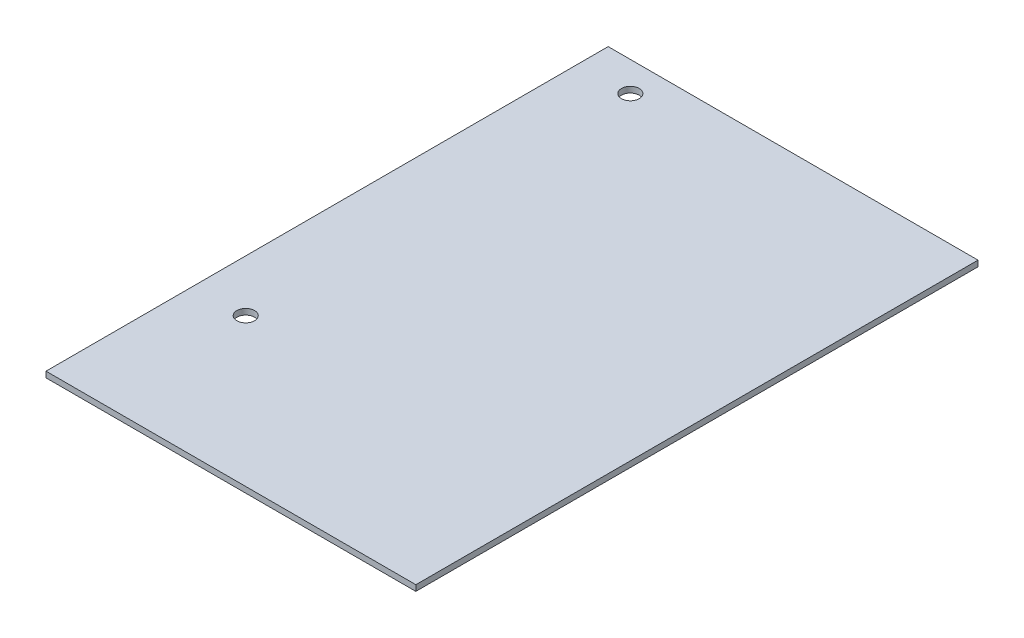
ISO-10303-21;
HEADER;
FILE_DESCRIPTION(('STEP AP214'),'2;1');
FILE_NAME('part.step','',(''),(''),'','','');
FILE_SCHEMA(('AUTOMOTIVE_DESIGN { 1 0 10303 214 1 1 1 1 }'));
ENDSEC;
DATA;
#1=APPLICATION_CONTEXT('core data for automotive mechanical design processes');
#2=APPLICATION_PROTOCOL_DEFINITION('international standard','automotive_design',2000,#1);
#3=PRODUCT_CONTEXT('',#1,'mechanical');
#4=PRODUCT('Part','Part','',(#3));
#5=PRODUCT_RELATED_PRODUCT_CATEGORY('part','',(#4));
#6=PRODUCT_DEFINITION_FORMATION('','',#4);
#7=PRODUCT_DEFINITION_CONTEXT('part definition',#1,'design');
#8=PRODUCT_DEFINITION('design','',#6,#7);
#9=PRODUCT_DEFINITION_SHAPE('','',#8);
#10=(LENGTH_UNIT() NAMED_UNIT(*) SI_UNIT(.MILLI.,.METRE.));
#11=(NAMED_UNIT(*) PLANE_ANGLE_UNIT() SI_UNIT($,.RADIAN.));
#12=(NAMED_UNIT(*) SI_UNIT($,.STERADIAN.) SOLID_ANGLE_UNIT());
#13=UNCERTAINTY_MEASURE_WITH_UNIT(LENGTH_MEASURE(1.E-05),#10,'distance_accuracy_value','');
#14=(GEOMETRIC_REPRESENTATION_CONTEXT(3) GLOBAL_UNCERTAINTY_ASSIGNED_CONTEXT((#13)) GLOBAL_UNIT_ASSIGNED_CONTEXT((#10,
#11,#12)) REPRESENTATION_CONTEXT('',''));
#15=CARTESIAN_POINT('',(0.,0.,0.));
#16=DIRECTION('',(0.,0.,1.));
#17=DIRECTION('',(1.,0.,0.));
#18=AXIS2_PLACEMENT_3D('',#15,#16,#17);
#19=CARTESIAN_POINT('',(0.,1.,0.));
#20=DIRECTION('',(1.,0.,0.));
#21=DIRECTION('',(0.,0.,-1.));
#22=AXIS2_PLACEMENT_3D('',#19,#20,#21);
#23=PLANE('',#22);
#24=DIRECTION('',(0.,0.,1.));
#25=VECTOR('',#24,1.);
#26=CARTESIAN_POINT('',(0.,0.,0.));
#27=LINE('',#26,#25);
#28=CARTESIAN_POINT('',(0.,0.,-96.52));
#29=VERTEX_POINT('',#28);
#30=CARTESIAN_POINT('',(0.,0.,0.));
#31=VERTEX_POINT('',#30);
#32=EDGE_CURVE('E98',#29,#31,#27,.T.);
#33=ORIENTED_EDGE('',*,*,#32,.T.);
#34=DIRECTION('',(0.,-1.,0.));
#35=VECTOR('',#34,1.);
#36=CARTESIAN_POINT('',(0.,1.,0.));
#37=LINE('',#36,#35);
#38=CARTESIAN_POINT('',(0.,1.,0.));
#39=VERTEX_POINT('',#38);
#40=EDGE_CURVE('E11',#39,#31,#37,.T.);
#41=ORIENTED_EDGE('',*,*,#40,.F.);
#42=DIRECTION('',(0.,0.,1.));
#43=VECTOR('',#42,1.);
#44=CARTESIAN_POINT('',(0.,1.,0.));
#45=LINE('',#44,#43);
#46=CARTESIAN_POINT('',(0.,1.,-96.52));
#47=VERTEX_POINT('',#46);
#48=EDGE_CURVE('E85',#47,#39,#45,.T.);
#49=ORIENTED_EDGE('',*,*,#48,.F.);
#50=DIRECTION('',(0.,-1.,0.));
#51=VECTOR('',#50,1.);
#52=CARTESIAN_POINT('',(0.,1.,-96.52));
#53=LINE('',#52,#51);
#54=EDGE_CURVE('E94',#47,#29,#53,.T.);
#55=ORIENTED_EDGE('',*,*,#54,.T.);
#56=EDGE_LOOP('',(#33,#41,#49,#55));
#57=FACE_BOUND('',#56,.T.);
#58=ADVANCED_FACE('F32',(#57),#23,.F.);
#59=CARTESIAN_POINT('',(0.,1.,0.));
#60=DIRECTION('',(0.,0.,-1.));
#61=DIRECTION('',(-1.,0.,0.));
#62=AXIS2_PLACEMENT_3D('',#59,#60,#61);
#63=PLANE('',#62);
#64=DIRECTION('',(1.,0.,0.));
#65=VECTOR('',#64,1.);
#66=CARTESIAN_POINT('',(0.,0.,0.));
#67=LINE('',#66,#65);
#68=CARTESIAN_POINT('',(63.5,0.,0.));
#69=VERTEX_POINT('',#68);
#70=EDGE_CURVE('E89',#31,#69,#67,.T.);
#71=ORIENTED_EDGE('',*,*,#70,.T.);
#72=DIRECTION('',(0.,-1.,0.));
#73=VECTOR('',#72,1.);
#74=CARTESIAN_POINT('',(63.5,1.,0.));
#75=LINE('',#74,#73);
#76=CARTESIAN_POINT('',(63.5,1.,0.));
#77=VERTEX_POINT('',#76);
#78=EDGE_CURVE('E41',#77,#69,#75,.T.);
#79=ORIENTED_EDGE('',*,*,#78,.F.);
#80=DIRECTION('',(1.,0.,0.));
#81=VECTOR('',#80,1.);
#82=CARTESIAN_POINT('',(0.,1.,0.));
#83=LINE('',#82,#81);
#84=EDGE_CURVE('E80',#39,#77,#83,.T.);
#85=ORIENTED_EDGE('',*,*,#84,.F.);
#86=ORIENTED_EDGE('',*,*,#40,.T.);
#87=EDGE_LOOP('',(#71,#79,#85,#86));
#88=FACE_BOUND('',#87,.T.);
#89=ADVANCED_FACE('F88',(#88),#63,.F.);
#90=CARTESIAN_POINT('',(63.5,1.,0.));
#91=DIRECTION('',(-1.,0.,0.));
#92=DIRECTION('',(0.,0.,1.));
#93=AXIS2_PLACEMENT_3D('',#90,#91,#92);
#94=PLANE('',#93);
#95=DIRECTION('',(0.,0.,-1.));
#96=VECTOR('',#95,1.);
#97=CARTESIAN_POINT('',(63.5,0.,0.));
#98=LINE('',#97,#96);
#99=CARTESIAN_POINT('',(63.5,0.,-96.52));
#100=VERTEX_POINT('',#99);
#101=EDGE_CURVE('E67',#69,#100,#98,.T.);
#102=ORIENTED_EDGE('',*,*,#101,.T.);
#103=DIRECTION('',(0.,-1.,0.));
#104=VECTOR('',#103,1.);
#105=CARTESIAN_POINT('',(63.5,1.,-96.52));
#106=LINE('',#105,#104);
#107=CARTESIAN_POINT('',(63.5,1.,-96.52));
#108=VERTEX_POINT('',#107);
#109=EDGE_CURVE('E90',#108,#100,#106,.T.);
#110=ORIENTED_EDGE('',*,*,#109,.F.);
#111=DIRECTION('',(0.,0.,-1.));
#112=VECTOR('',#111,1.);
#113=CARTESIAN_POINT('',(63.5,1.,0.));
#114=LINE('',#113,#112);
#115=EDGE_CURVE('E83',#77,#108,#114,.T.);
#116=ORIENTED_EDGE('',*,*,#115,.F.);
#117=ORIENTED_EDGE('',*,*,#78,.T.);
#118=EDGE_LOOP('',(#102,#110,#116,#117));
#119=FACE_BOUND('',#118,.T.);
#120=ADVANCED_FACE('F92',(#119),#94,.F.);
#121=CARTESIAN_POINT('',(0.,1.,-96.52));
#122=DIRECTION('',(0.,0.,1.));
#123=DIRECTION('',(1.,0.,0.));
#124=AXIS2_PLACEMENT_3D('',#121,#122,#123);
#125=PLANE('',#124);
#126=DIRECTION('',(-1.,0.,0.));
#127=VECTOR('',#126,1.);
#128=CARTESIAN_POINT('',(0.,0.,-96.52));
#129=LINE('',#128,#127);
#130=EDGE_CURVE('E73',#100,#29,#129,.T.);
#131=ORIENTED_EDGE('',*,*,#130,.T.);
#132=ORIENTED_EDGE('',*,*,#54,.F.);
#133=DIRECTION('',(-1.,0.,0.));
#134=VECTOR('',#133,1.);
#135=CARTESIAN_POINT('',(0.,1.,-96.52));
#136=LINE('',#135,#134);
#137=EDGE_CURVE('E50',#108,#47,#136,.T.);
#138=ORIENTED_EDGE('',*,*,#137,.F.);
#139=ORIENTED_EDGE('',*,*,#109,.T.);
#140=EDGE_LOOP('',(#131,#132,#138,#139));
#141=FACE_BOUND('',#140,.T.);
#142=ADVANCED_FACE('F125',(#141),#125,.F.);
#143=CARTESIAN_POINT('',(0.,1.,0.));
#144=DIRECTION('',(0.,-1.,0.));
#145=DIRECTION('',(0.,0.,-1.));
#146=AXIS2_PLACEMENT_3D('',#143,#144,#145);
#147=PLANE('',#146);
#148=CARTESIAN_POINT('',(8.89,1.,-25.4));
#149=DIRECTION('',(0.,1.,0.));
#150=DIRECTION('',(0.,0.,1.));
#151=AXIS2_PLACEMENT_3D('',#148,#149,#150);
#152=CIRCLE('',#151,1.524);
#153=CARTESIAN_POINT('',(8.89,1.,-23.876));
#154=VERTEX_POINT('',#153);
#155=EDGE_CURVE('E115',#154,#154,#152,.T.);
#156=ORIENTED_EDGE('',*,*,#155,.F.);
#157=EDGE_LOOP('',(#156));
#158=FACE_BOUND('',#157,.T.);
#159=CARTESIAN_POINT('',(8.89,1.,-91.44));
#160=DIRECTION('',(0.,1.,0.));
#161=DIRECTION('',(0.,0.,1.));
#162=AXIS2_PLACEMENT_3D('',#159,#160,#161);
#163=CIRCLE('',#162,1.524);
#164=CARTESIAN_POINT('',(8.89,1.,-89.916));
#165=VERTEX_POINT('',#164);
#166=EDGE_CURVE('E107',#165,#165,#163,.T.);
#167=ORIENTED_EDGE('',*,*,#166,.F.);
#168=EDGE_LOOP('',(#167));
#169=FACE_BOUND('',#168,.T.);
#170=ORIENTED_EDGE('',*,*,#48,.T.);
#171=ORIENTED_EDGE('',*,*,#84,.T.);
#172=ORIENTED_EDGE('',*,*,#115,.T.);
#173=ORIENTED_EDGE('',*,*,#137,.T.);
#174=EDGE_LOOP('',(#170,#171,#172,#173));
#175=FACE_BOUND('',#174,.T.);
#176=ADVANCED_FACE('F81',(#158,#169,#175),#147,.F.);
#177=CARTESIAN_POINT('',(0.,0.,0.));
#178=DIRECTION('',(0.,-1.,0.));
#179=DIRECTION('',(0.,0.,-1.));
#180=AXIS2_PLACEMENT_3D('',#177,#178,#179);
#181=PLANE('',#180);
#182=CARTESIAN_POINT('',(8.89,0.,-25.4));
#183=DIRECTION('',(0.,-1.,0.));
#184=DIRECTION('',(0.,0.,-1.));
#185=AXIS2_PLACEMENT_3D('',#182,#183,#184);
#186=CIRCLE('',#185,1.524);
#187=CARTESIAN_POINT('',(8.89,0.,-26.924));
#188=VERTEX_POINT('',#187);
#189=EDGE_CURVE('E35',#188,#188,#186,.T.);
#190=ORIENTED_EDGE('',*,*,#189,.F.);
#191=EDGE_LOOP('',(#190));
#192=FACE_BOUND('',#191,.T.);
#193=CARTESIAN_POINT('',(8.89,0.,-91.44));
#194=DIRECTION('',(0.,-1.,0.));
#195=DIRECTION('',(0.,0.,-1.));
#196=AXIS2_PLACEMENT_3D('',#193,#194,#195);
#197=CIRCLE('',#196,1.524);
#198=CARTESIAN_POINT('',(8.89,0.,-92.964));
#199=VERTEX_POINT('',#198);
#200=EDGE_CURVE('E101',#199,#199,#197,.T.);
#201=ORIENTED_EDGE('',*,*,#200,.F.);
#202=EDGE_LOOP('',(#201));
#203=FACE_BOUND('',#202,.T.);
#204=ORIENTED_EDGE('',*,*,#32,.F.);
#205=ORIENTED_EDGE('',*,*,#130,.F.);
#206=ORIENTED_EDGE('',*,*,#101,.F.);
#207=ORIENTED_EDGE('',*,*,#70,.F.);
#208=EDGE_LOOP('',(#204,#205,#206,#207));
#209=FACE_BOUND('',#208,.T.);
#210=ADVANCED_FACE('F124',(#192,#203,#209),#181,.T.);
#211=CARTESIAN_POINT('',(8.89,-1.,-91.44));
#212=DIRECTION('',(0.,1.,0.));
#213=DIRECTION('',(0.,0.,1.));
#214=AXIS2_PLACEMENT_3D('',#211,#212,#213);
#215=CYLINDRICAL_SURFACE('',#214,1.524);
#216=ORIENTED_EDGE('',*,*,#200,.T.);
#217=EDGE_LOOP('',(#216));
#218=FACE_BOUND('',#217,.T.);
#219=ORIENTED_EDGE('',*,*,#166,.T.);
#220=EDGE_LOOP('',(#219));
#221=FACE_BOUND('',#220,.T.);
#222=ADVANCED_FACE('F131',(#218,#221),#215,.F.);
#223=CARTESIAN_POINT('',(8.89,-2.,-25.4));
#224=DIRECTION('',(0.,1.,0.));
#225=DIRECTION('',(0.,0.,1.));
#226=AXIS2_PLACEMENT_3D('',#223,#224,#225);
#227=CYLINDRICAL_SURFACE('',#226,1.524);
#228=ORIENTED_EDGE('',*,*,#189,.T.);
#229=EDGE_LOOP('',(#228));
#230=FACE_BOUND('',#229,.T.);
#231=ORIENTED_EDGE('',*,*,#155,.T.);
#232=EDGE_LOOP('',(#231));
#233=FACE_BOUND('',#232,.T.);
#234=ADVANCED_FACE('F120',(#230,#233),#227,.F.);
#235=CLOSED_SHELL('',(#58,#89,#120,#142,#176,#210,#222,#234));
#236=MANIFOLD_SOLID_BREP('B2',#235);
#237=ADVANCED_BREP_SHAPE_REPRESENTATION('',(#18,#236),#14);
#238=SHAPE_DEFINITION_REPRESENTATION(#9,#237);
ENDSEC;
END-ISO-10303-21;
